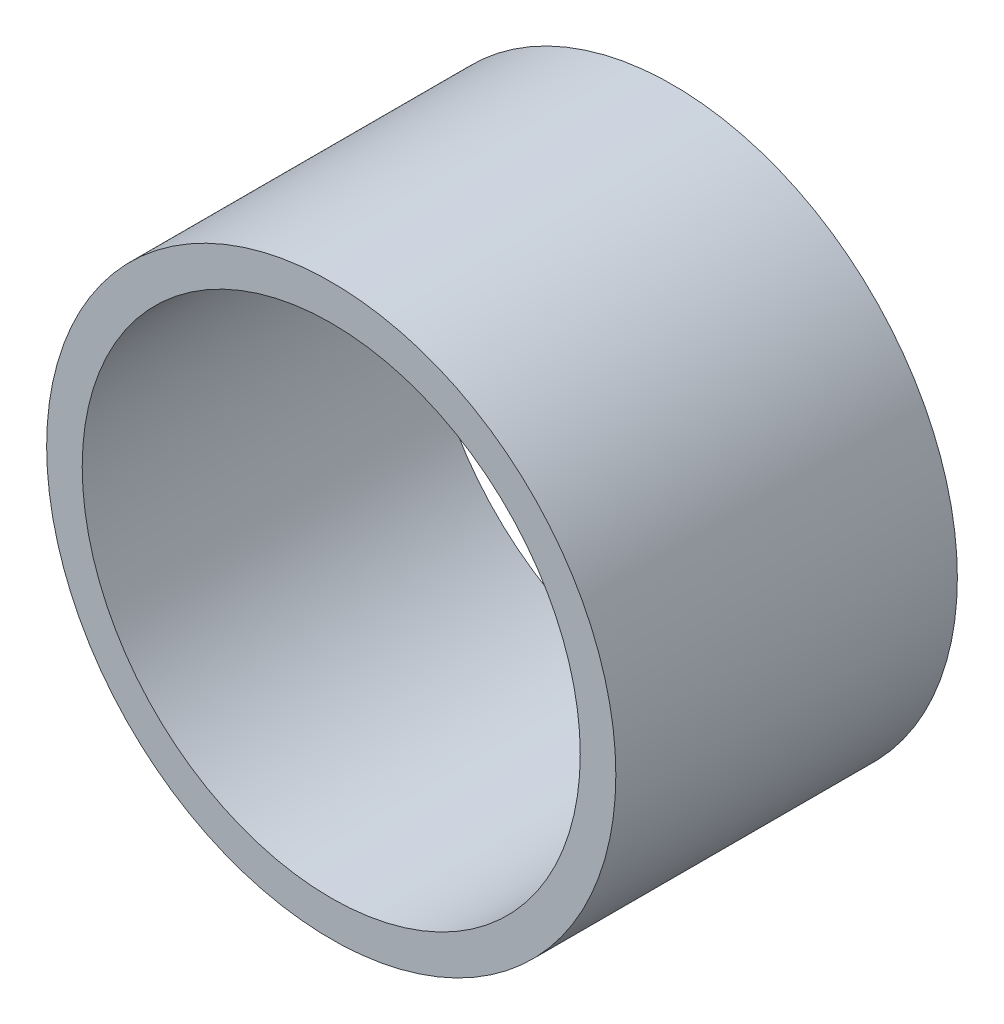
ISO-10303-21;
HEADER;
FILE_DESCRIPTION(('STEP AP214'),'2;1');
FILE_NAME('part.step','',(''),(''),'','','');
FILE_SCHEMA(('AUTOMOTIVE_DESIGN { 1 0 10303 214 1 1 1 1 }'));
ENDSEC;
DATA;
#1=APPLICATION_CONTEXT('core data for automotive mechanical design processes');
#2=APPLICATION_PROTOCOL_DEFINITION('international standard','automotive_design',2000,#1);
#3=PRODUCT_CONTEXT('',#1,'mechanical');
#4=PRODUCT('Part','Part','',(#3));
#5=PRODUCT_RELATED_PRODUCT_CATEGORY('part','',(#4));
#6=PRODUCT_DEFINITION_FORMATION('','',#4);
#7=PRODUCT_DEFINITION_CONTEXT('part definition',#1,'design');
#8=PRODUCT_DEFINITION('design','',#6,#7);
#9=PRODUCT_DEFINITION_SHAPE('','',#8);
#10=(LENGTH_UNIT() NAMED_UNIT(*) SI_UNIT(.MILLI.,.METRE.));
#11=(NAMED_UNIT(*) PLANE_ANGLE_UNIT() SI_UNIT($,.RADIAN.));
#12=(NAMED_UNIT(*) SI_UNIT($,.STERADIAN.) SOLID_ANGLE_UNIT());
#13=UNCERTAINTY_MEASURE_WITH_UNIT(LENGTH_MEASURE(1.E-05),#10,'distance_accuracy_value','');
#14=(GEOMETRIC_REPRESENTATION_CONTEXT(3) GLOBAL_UNCERTAINTY_ASSIGNED_CONTEXT((#13)) GLOBAL_UNIT_ASSIGNED_CONTEXT((#10,
#11,#12)) REPRESENTATION_CONTEXT('',''));
#15=CARTESIAN_POINT('',(0.,0.,0.));
#16=DIRECTION('',(0.,0.,1.));
#17=DIRECTION('',(1.,0.,0.));
#18=AXIS2_PLACEMENT_3D('',#15,#16,#17);
#19=CARTESIAN_POINT('',(10.,0.,-12.));
#20=DIRECTION('',(0.,0.,1.));
#21=DIRECTION('',(1.,0.,0.));
#22=AXIS2_PLACEMENT_3D('',#19,#20,#21);
#23=PLANE('',#22);
#24=CARTESIAN_POINT('',(0.,0.,-12.));
#25=DIRECTION('',(0.,0.,-1.));
#26=DIRECTION('',(-1.,0.,0.));
#27=AXIS2_PLACEMENT_3D('',#24,#25,#26);
#28=CIRCLE('',#27,8.75);
#29=CARTESIAN_POINT('',(-8.75,0.,-12.));
#30=VERTEX_POINT('',#29);
#31=EDGE_CURVE('E10',#30,#30,#28,.T.);
#32=ORIENTED_EDGE('',*,*,#31,.F.);
#33=EDGE_LOOP('',(#32));
#34=FACE_BOUND('',#33,.T.);
#35=CARTESIAN_POINT('',(0.,0.,-12.));
#36=DIRECTION('',(0.,0.,-1.));
#37=DIRECTION('',(-1.,0.,0.));
#38=AXIS2_PLACEMENT_3D('',#35,#36,#37);
#39=CIRCLE('',#38,10.);
#40=CARTESIAN_POINT('',(-10.,0.,-12.));
#41=VERTEX_POINT('',#40);
#42=EDGE_CURVE('E47',#41,#41,#39,.T.);
#43=ORIENTED_EDGE('',*,*,#42,.T.);
#44=EDGE_LOOP('',(#43));
#45=FACE_BOUND('',#44,.T.);
#46=ADVANCED_FACE('F33',(#34,#45),#23,.F.);
#47=CARTESIAN_POINT('',(0.,0.,-12.5117270788913));
#48=DIRECTION('',(0.,0.,-1.));
#49=DIRECTION('',(-1.,0.,0.));
#50=AXIS2_PLACEMENT_3D('',#47,#48,#49);
#51=CYLINDRICAL_SURFACE('',#50,8.75);
#52=CARTESIAN_POINT('',(0.,0.,0.));
#53=DIRECTION('',(0.,0.,-1.));
#54=DIRECTION('',(-1.,0.,0.));
#55=AXIS2_PLACEMENT_3D('',#52,#53,#54);
#56=CIRCLE('',#55,8.75);
#57=CARTESIAN_POINT('',(-8.75,0.,0.));
#58=VERTEX_POINT('',#57);
#59=EDGE_CURVE('E39',#58,#58,#56,.T.);
#60=ORIENTED_EDGE('',*,*,#59,.F.);
#61=EDGE_LOOP('',(#60));
#62=FACE_BOUND('',#61,.T.);
#63=ORIENTED_EDGE('',*,*,#31,.T.);
#64=EDGE_LOOP('',(#63));
#65=FACE_BOUND('',#64,.T.);
#66=ADVANCED_FACE('F62',(#62,#65),#51,.F.);
#67=CARTESIAN_POINT('',(8.75,0.,0.));
#68=DIRECTION('',(0.,0.,-1.));
#69=DIRECTION('',(-1.,0.,0.));
#70=AXIS2_PLACEMENT_3D('',#67,#68,#69);
#71=PLANE('',#70);
#72=CARTESIAN_POINT('',(0.,0.,0.));
#73=DIRECTION('',(0.,0.,-1.));
#74=DIRECTION('',(-1.,0.,0.));
#75=AXIS2_PLACEMENT_3D('',#72,#73,#74);
#76=CIRCLE('',#75,10.);
#77=CARTESIAN_POINT('',(-10.,0.,0.));
#78=VERTEX_POINT('',#77);
#79=EDGE_CURVE('E43',#78,#78,#76,.T.);
#80=ORIENTED_EDGE('',*,*,#79,.F.);
#81=EDGE_LOOP('',(#80));
#82=FACE_BOUND('',#81,.T.);
#83=ORIENTED_EDGE('',*,*,#59,.T.);
#84=EDGE_LOOP('',(#83));
#85=FACE_BOUND('',#84,.T.);
#86=ADVANCED_FACE('F57',(#82,#85),#71,.F.);
#87=CARTESIAN_POINT('',(0.,0.,-12.5117270788913));
#88=DIRECTION('',(0.,0.,-1.));
#89=DIRECTION('',(-1.,0.,0.));
#90=AXIS2_PLACEMENT_3D('',#87,#88,#89);
#91=CYLINDRICAL_SURFACE('',#90,10.);
#92=ORIENTED_EDGE('',*,*,#42,.F.);
#93=EDGE_LOOP('',(#92));
#94=FACE_BOUND('',#93,.T.);
#95=ORIENTED_EDGE('',*,*,#79,.T.);
#96=EDGE_LOOP('',(#95));
#97=FACE_BOUND('',#96,.T.);
#98=ADVANCED_FACE('F54',(#94,#97),#91,.T.);
#99=CLOSED_SHELL('',(#46,#66,#86,#98));
#100=MANIFOLD_SOLID_BREP('B2',#99);
#101=ADVANCED_BREP_SHAPE_REPRESENTATION('',(#18,#100),#14);
#102=SHAPE_DEFINITION_REPRESENTATION(#9,#101);
ENDSEC;
END-ISO-10303-21;
